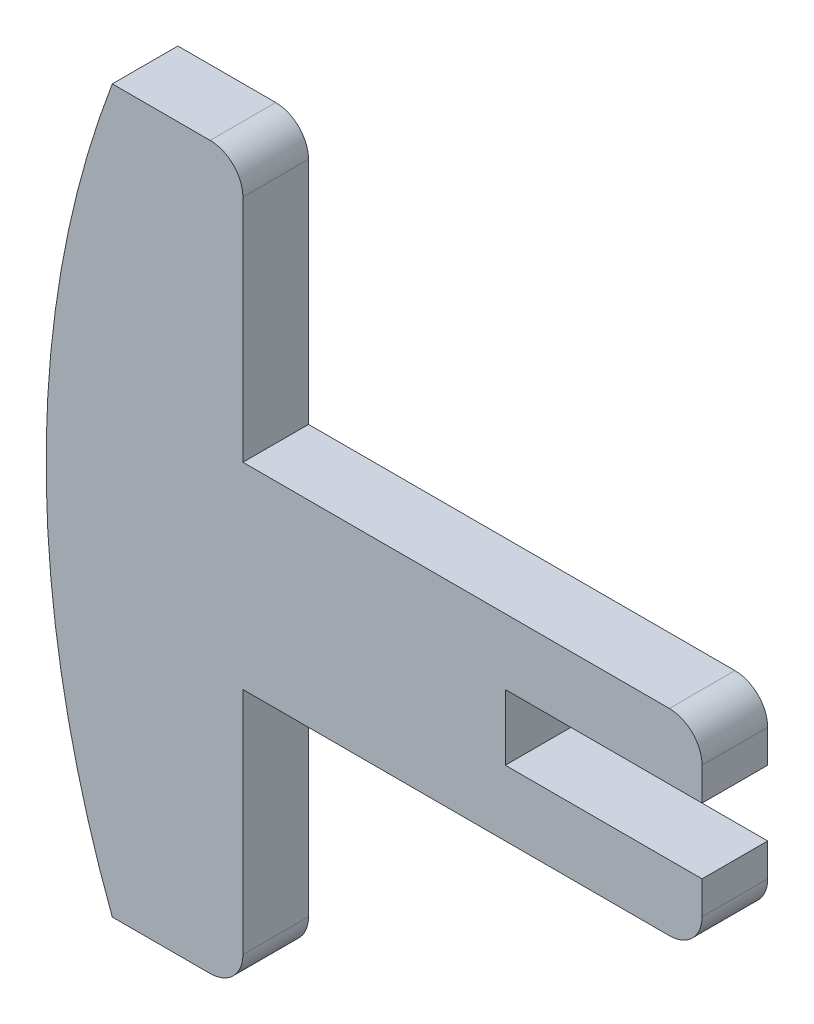
ISO-10303-21;
HEADER;
FILE_DESCRIPTION(('STEP AP214'),'2;1');
FILE_NAME('part.step','',(''),(''),'','','');
FILE_SCHEMA(('AUTOMOTIVE_DESIGN { 1 0 10303 214 1 1 1 1 }'));
ENDSEC;
DATA;
#1=APPLICATION_CONTEXT('core data for automotive mechanical design processes');
#2=APPLICATION_PROTOCOL_DEFINITION('international standard','automotive_design',2000,#1);
#3=PRODUCT_CONTEXT('',#1,'mechanical');
#4=PRODUCT('Part','Part','',(#3));
#5=PRODUCT_RELATED_PRODUCT_CATEGORY('part','',(#4));
#6=PRODUCT_DEFINITION_FORMATION('','',#4);
#7=PRODUCT_DEFINITION_CONTEXT('part definition',#1,'design');
#8=PRODUCT_DEFINITION('design','',#6,#7);
#9=PRODUCT_DEFINITION_SHAPE('','',#8);
#10=(LENGTH_UNIT() NAMED_UNIT(*) SI_UNIT(.MILLI.,.METRE.));
#11=(NAMED_UNIT(*) PLANE_ANGLE_UNIT() SI_UNIT($,.RADIAN.));
#12=(NAMED_UNIT(*) SI_UNIT($,.STERADIAN.) SOLID_ANGLE_UNIT());
#13=UNCERTAINTY_MEASURE_WITH_UNIT(LENGTH_MEASURE(1.E-05),#10,'distance_accuracy_value','');
#14=(GEOMETRIC_REPRESENTATION_CONTEXT(3) GLOBAL_UNCERTAINTY_ASSIGNED_CONTEXT((#13)) GLOBAL_UNIT_ASSIGNED_CONTEXT((#10,
#11,#12)) REPRESENTATION_CONTEXT('',''));
#15=CARTESIAN_POINT('',(0.,0.,0.));
#16=DIRECTION('',(0.,0.,1.));
#17=DIRECTION('',(1.,0.,0.));
#18=AXIS2_PLACEMENT_3D('',#15,#16,#17);
#19=CARTESIAN_POINT('',(-24.9999994718478,9.99999999999999,2.));
#20=DIRECTION('',(-1.,0.,0.));
#21=DIRECTION('',(0.,0.,1.));
#22=AXIS2_PLACEMENT_3D('',#19,#20,#21);
#23=PLANE('',#22);
#24=DIRECTION('',(0.,1.,0.));
#25=VECTOR('',#24,1.);
#26=CARTESIAN_POINT('',(-24.9999994718478,9.99999999999999,0.));
#27=LINE('',#26,#25);
#28=CARTESIAN_POINT('',(-24.9999994718478,2.99999999999999,0.));
#29=VERTEX_POINT('',#28);
#30=CARTESIAN_POINT('',(-24.9999994718478,9.99999999999999,0.));
#31=VERTEX_POINT('',#30);
#32=EDGE_CURVE('E178',#29,#31,#27,.T.);
#33=ORIENTED_EDGE('',*,*,#32,.T.);
#34=DIRECTION('',(0.,0.,-1.));
#35=VECTOR('',#34,1.);
#36=CARTESIAN_POINT('',(-24.9999994718478,9.99999999999999,2.));
#37=LINE('',#36,#35);
#38=CARTESIAN_POINT('',(-24.9999994718478,9.99999999999999,2.));
#39=VERTEX_POINT('',#38);
#40=EDGE_CURVE('E11',#39,#31,#37,.T.);
#41=ORIENTED_EDGE('',*,*,#40,.F.);
#42=DIRECTION('',(0.,1.,0.));
#43=VECTOR('',#42,1.);
#44=CARTESIAN_POINT('',(-24.9999994718478,9.99999999999999,2.));
#45=LINE('',#44,#43);
#46=CARTESIAN_POINT('',(-24.9999994718478,2.99999999999999,2.));
#47=VERTEX_POINT('',#46);
#48=EDGE_CURVE('E208',#47,#39,#45,.T.);
#49=ORIENTED_EDGE('',*,*,#48,.F.);
#50=DIRECTION('',(0.,0.,-1.));
#51=VECTOR('',#50,1.);
#52=CARTESIAN_POINT('',(-24.9999994718478,2.99999999999999,2.));
#53=LINE('',#52,#51);
#54=EDGE_CURVE('E174',#47,#29,#53,.T.);
#55=ORIENTED_EDGE('',*,*,#54,.T.);
#56=EDGE_LOOP('',(#33,#41,#49,#55));
#57=FACE_BOUND('',#56,.T.);
#58=ADVANCED_FACE('F34',(#57),#23,.F.);
#59=CARTESIAN_POINT('',(-25.9999994718478,10.,2.));
#60=DIRECTION('',(0.,0.,-1.));
#61=DIRECTION('',(-1.,0.,0.));
#62=AXIS2_PLACEMENT_3D('',#59,#60,#61);
#63=CYLINDRICAL_SURFACE('',#62,1.);
#64=CARTESIAN_POINT('',(-25.9999994718478,10.,0.));
#65=DIRECTION('',(0.,0.,1.));
#66=DIRECTION('',(1.,0.,0.));
#67=AXIS2_PLACEMENT_3D('',#64,#65,#66);
#68=CIRCLE('',#67,1.);
#69=CARTESIAN_POINT('',(-25.9999994718478,11.,0.));
#70=VERTEX_POINT('',#69);
#71=EDGE_CURVE('E181',#31,#70,#68,.T.);
#72=ORIENTED_EDGE('',*,*,#71,.T.);
#73=DIRECTION('',(0.,0.,-1.));
#74=VECTOR('',#73,1.);
#75=CARTESIAN_POINT('',(-25.9999994718478,11.,2.));
#76=LINE('',#75,#74);
#77=CARTESIAN_POINT('',(-25.9999994718478,11.,2.));
#78=VERTEX_POINT('',#77);
#79=EDGE_CURVE('E42',#78,#70,#76,.T.);
#80=ORIENTED_EDGE('',*,*,#79,.F.);
#81=CARTESIAN_POINT('',(-25.9999994718478,10.,2.));
#82=DIRECTION('',(0.,0.,1.));
#83=DIRECTION('',(1.,0.,0.));
#84=AXIS2_PLACEMENT_3D('',#81,#82,#83);
#85=CIRCLE('',#84,1.);
#86=EDGE_CURVE('E117',#39,#78,#85,.T.);
#87=ORIENTED_EDGE('',*,*,#86,.F.);
#88=ORIENTED_EDGE('',*,*,#40,.T.);
#89=EDGE_LOOP('',(#72,#80,#87,#88));
#90=FACE_BOUND('',#89,.T.);
#91=ADVANCED_FACE('F306',(#90),#63,.T.);
#92=CARTESIAN_POINT('',(-28.9827534923789,11.,2.));
#93=DIRECTION('',(0.,-1.,0.));
#94=DIRECTION('',(0.,0.,-1.));
#95=AXIS2_PLACEMENT_3D('',#92,#93,#94);
#96=PLANE('',#95);
#97=DIRECTION('',(-1.,0.,0.));
#98=VECTOR('',#97,1.);
#99=CARTESIAN_POINT('',(-28.9827534923789,11.,0.));
#100=LINE('',#99,#98);
#101=CARTESIAN_POINT('',(-28.9827534923789,11.,0.));
#102=VERTEX_POINT('',#101);
#103=EDGE_CURVE('E183',#70,#102,#100,.T.);
#104=ORIENTED_EDGE('',*,*,#103,.T.);
#105=DIRECTION('',(0.,0.,-1.));
#106=VECTOR('',#105,1.);
#107=CARTESIAN_POINT('',(-28.9827534923789,11.,2.));
#108=LINE('',#107,#106);
#109=CARTESIAN_POINT('',(-28.9827534923789,11.,2.));
#110=VERTEX_POINT('',#109);
#111=EDGE_CURVE('E239',#110,#102,#108,.T.);
#112=ORIENTED_EDGE('',*,*,#111,.F.);
#113=DIRECTION('',(-1.,0.,0.));
#114=VECTOR('',#113,1.);
#115=CARTESIAN_POINT('',(-28.9827534923789,11.,2.));
#116=LINE('',#115,#114);
#117=EDGE_CURVE('E247',#78,#110,#116,.T.);
#118=ORIENTED_EDGE('',*,*,#117,.F.);
#119=ORIENTED_EDGE('',*,*,#79,.T.);
#120=EDGE_LOOP('',(#104,#112,#118,#119));
#121=FACE_BOUND('',#120,.T.);
#122=ADVANCED_FACE('F245',(#121),#96,.F.);
#123=CARTESIAN_POINT('',(0.,0.,2.));
#124=DIRECTION('',(0.,0.,-1.));
#125=DIRECTION('',(-1.,0.,0.));
#126=AXIS2_PLACEMENT_3D('',#123,#124,#125);
#127=CYLINDRICAL_SURFACE('',#126,31.);
#128=CARTESIAN_POINT('',(0.,0.,0.));
#129=DIRECTION('',(0.,0.,1.));
#130=DIRECTION('',(1.,0.,0.));
#131=AXIS2_PLACEMENT_3D('',#128,#129,#130);
#132=CIRCLE('',#131,31.);
#133=CARTESIAN_POINT('',(-28.9827534923789,-11.,0.));
#134=VERTEX_POINT('',#133);
#135=EDGE_CURVE('E185',#102,#134,#132,.T.);
#136=ORIENTED_EDGE('',*,*,#135,.T.);
#137=DIRECTION('',(0.,0.,-1.));
#138=VECTOR('',#137,1.);
#139=CARTESIAN_POINT('',(-28.9827534923789,-11.,2.));
#140=LINE('',#139,#138);
#141=CARTESIAN_POINT('',(-28.9827534923789,-11.,2.));
#142=VERTEX_POINT('',#141);
#143=EDGE_CURVE('E236',#142,#134,#140,.T.);
#144=ORIENTED_EDGE('',*,*,#143,.F.);
#145=CARTESIAN_POINT('',(0.,0.,2.));
#146=DIRECTION('',(0.,0.,1.));
#147=DIRECTION('',(1.,0.,0.));
#148=AXIS2_PLACEMENT_3D('',#145,#146,#147);
#149=CIRCLE('',#148,31.);
#150=EDGE_CURVE('E265',#110,#142,#149,.T.);
#151=ORIENTED_EDGE('',*,*,#150,.F.);
#152=ORIENTED_EDGE('',*,*,#111,.T.);
#153=EDGE_LOOP('',(#136,#144,#151,#152));
#154=FACE_BOUND('',#153,.T.);
#155=ADVANCED_FACE('F256',(#154),#127,.T.);
#156=CARTESIAN_POINT('',(-28.9827534923789,-11.,2.));
#157=DIRECTION('',(0.,1.,0.));
#158=DIRECTION('',(-1.,0.,0.));
#159=AXIS2_PLACEMENT_3D('',#156,#157,#158);
#160=PLANE('',#159);
#161=DIRECTION('',(1.,0.,0.));
#162=VECTOR('',#161,1.);
#163=CARTESIAN_POINT('',(-28.9827534923789,-11.,0.));
#164=LINE('',#163,#162);
#165=CARTESIAN_POINT('',(-25.9999994718478,-11.,0.));
#166=VERTEX_POINT('',#165);
#167=EDGE_CURVE('E187',#134,#166,#164,.T.);
#168=ORIENTED_EDGE('',*,*,#167,.T.);
#169=DIRECTION('',(0.,0.,-1.));
#170=VECTOR('',#169,1.);
#171=CARTESIAN_POINT('',(-25.9999994718478,-11.,2.));
#172=LINE('',#171,#170);
#173=CARTESIAN_POINT('',(-25.9999994718478,-11.,2.));
#174=VERTEX_POINT('',#173);
#175=EDGE_CURVE('E233',#174,#166,#172,.T.);
#176=ORIENTED_EDGE('',*,*,#175,.F.);
#177=DIRECTION('',(1.,0.,0.));
#178=VECTOR('',#177,1.);
#179=CARTESIAN_POINT('',(-28.9827534923789,-11.,2.));
#180=LINE('',#179,#178);
#181=EDGE_CURVE('E262',#142,#174,#180,.T.);
#182=ORIENTED_EDGE('',*,*,#181,.F.);
#183=ORIENTED_EDGE('',*,*,#143,.T.);
#184=EDGE_LOOP('',(#168,#176,#182,#183));
#185=FACE_BOUND('',#184,.T.);
#186=ADVANCED_FACE('F260',(#185),#160,.F.);
#187=CARTESIAN_POINT('',(-25.9999994718478,-9.99999999999999,2.));
#188=DIRECTION('',(0.,0.,-1.));
#189=DIRECTION('',(-1.,0.,0.));
#190=AXIS2_PLACEMENT_3D('',#187,#188,#189);
#191=CYLINDRICAL_SURFACE('',#190,1.);
#192=CARTESIAN_POINT('',(-25.9999994718478,-9.99999999999999,0.));
#193=DIRECTION('',(0.,0.,1.));
#194=DIRECTION('',(-1.,0.,0.));
#195=AXIS2_PLACEMENT_3D('',#192,#193,#194);
#196=CIRCLE('',#195,1.);
#197=CARTESIAN_POINT('',(-24.9999994718478,-9.99999999999998,0.));
#198=VERTEX_POINT('',#197);
#199=EDGE_CURVE('E189',#166,#198,#196,.T.);
#200=ORIENTED_EDGE('',*,*,#199,.T.);
#201=DIRECTION('',(0.,0.,-1.));
#202=VECTOR('',#201,1.);
#203=CARTESIAN_POINT('',(-24.9999994718478,-9.99999999999998,2.));
#204=LINE('',#203,#202);
#205=CARTESIAN_POINT('',(-24.9999994718478,-9.99999999999998,2.));
#206=VERTEX_POINT('',#205);
#207=EDGE_CURVE('E230',#206,#198,#204,.T.);
#208=ORIENTED_EDGE('',*,*,#207,.F.);
#209=CARTESIAN_POINT('',(-25.9999994718478,-9.99999999999999,2.));
#210=DIRECTION('',(0.,0.,1.));
#211=DIRECTION('',(-1.,0.,0.));
#212=AXIS2_PLACEMENT_3D('',#209,#210,#211);
#213=CIRCLE('',#212,1.);
#214=EDGE_CURVE('E264',#174,#206,#213,.T.);
#215=ORIENTED_EDGE('',*,*,#214,.F.);
#216=ORIENTED_EDGE('',*,*,#175,.T.);
#217=EDGE_LOOP('',(#200,#208,#215,#216));
#218=FACE_BOUND('',#217,.T.);
#219=ADVANCED_FACE('F319',(#218),#191,.T.);
#220=CARTESIAN_POINT('',(-24.9999994718478,-2.99999999999999,2.));
#221=DIRECTION('',(-1.,0.,0.));
#222=DIRECTION('',(0.,-1.,0.));
#223=AXIS2_PLACEMENT_3D('',#220,#221,#222);
#224=PLANE('',#223);
#225=DIRECTION('',(0.,1.,0.));
#226=VECTOR('',#225,1.);
#227=CARTESIAN_POINT('',(-24.9999994718478,-2.99999999999999,0.));
#228=LINE('',#227,#226);
#229=CARTESIAN_POINT('',(-24.9999994718478,-2.99999999999999,0.));
#230=VERTEX_POINT('',#229);
#231=EDGE_CURVE('E191',#198,#230,#228,.T.);
#232=ORIENTED_EDGE('',*,*,#231,.T.);
#233=DIRECTION('',(0.,0.,-1.));
#234=VECTOR('',#233,1.);
#235=CARTESIAN_POINT('',(-24.9999994718478,-2.99999999999999,2.));
#236=LINE('',#235,#234);
#237=CARTESIAN_POINT('',(-24.9999994718478,-2.99999999999999,2.));
#238=VERTEX_POINT('',#237);
#239=EDGE_CURVE('E227',#238,#230,#236,.T.);
#240=ORIENTED_EDGE('',*,*,#239,.F.);
#241=DIRECTION('',(0.,1.,0.));
#242=VECTOR('',#241,1.);
#243=CARTESIAN_POINT('',(-24.9999994718478,-2.99999999999999,2.));
#244=LINE('',#243,#242);
#245=EDGE_CURVE('E267',#206,#238,#244,.T.);
#246=ORIENTED_EDGE('',*,*,#245,.F.);
#247=ORIENTED_EDGE('',*,*,#207,.T.);
#248=EDGE_LOOP('',(#232,#240,#246,#247));
#249=FACE_BOUND('',#248,.T.);
#250=ADVANCED_FACE('F322',(#249),#224,.F.);
#251=CARTESIAN_POINT('',(-24.9999994718478,-2.99999999999999,2.));
#252=DIRECTION('',(0.,1.,0.));
#253=DIRECTION('',(-1.,0.,0.));
#254=AXIS2_PLACEMENT_3D('',#251,#252,#253);
#255=PLANE('',#254);
#256=DIRECTION('',(1.,0.,0.));
#257=VECTOR('',#256,1.);
#258=CARTESIAN_POINT('',(-24.9999994718478,-2.99999999999999,0.));
#259=LINE('',#258,#257);
#260=CARTESIAN_POINT('',(-12.,-2.99999999999999,0.));
#261=VERTEX_POINT('',#260);
#262=EDGE_CURVE('E193',#230,#261,#259,.T.);
#263=ORIENTED_EDGE('',*,*,#262,.T.);
#264=DIRECTION('',(0.,0.,-1.));
#265=VECTOR('',#264,1.);
#266=CARTESIAN_POINT('',(-12.,-2.99999999999999,2.));
#267=LINE('',#266,#265);
#268=CARTESIAN_POINT('',(-12.,-2.99999999999999,2.));
#269=VERTEX_POINT('',#268);
#270=EDGE_CURVE('E224',#269,#261,#267,.T.);
#271=ORIENTED_EDGE('',*,*,#270,.F.);
#272=DIRECTION('',(1.,0.,0.));
#273=VECTOR('',#272,1.);
#274=CARTESIAN_POINT('',(-24.9999994718478,-2.99999999999999,2.));
#275=LINE('',#274,#273);
#276=EDGE_CURVE('E273',#238,#269,#275,.T.);
#277=ORIENTED_EDGE('',*,*,#276,.F.);
#278=ORIENTED_EDGE('',*,*,#239,.T.);
#279=EDGE_LOOP('',(#263,#271,#277,#278));
#280=FACE_BOUND('',#279,.T.);
#281=ADVANCED_FACE('F326',(#280),#255,.F.);
#282=CARTESIAN_POINT('',(-12.,-1.99999999999999,2.));
#283=DIRECTION('',(0.,0.,-1.));
#284=DIRECTION('',(-1.,0.,0.));
#285=AXIS2_PLACEMENT_3D('',#282,#283,#284);
#286=CYLINDRICAL_SURFACE('',#285,1.);
#287=CARTESIAN_POINT('',(-12.,-1.99999999999999,0.));
#288=DIRECTION('',(0.,0.,1.));
#289=DIRECTION('',(-1.,0.,0.));
#290=AXIS2_PLACEMENT_3D('',#287,#288,#289);
#291=CIRCLE('',#290,1.);
#292=CARTESIAN_POINT('',(-11.,-1.99999999999998,0.));
#293=VERTEX_POINT('',#292);
#294=EDGE_CURVE('E195',#261,#293,#291,.T.);
#295=ORIENTED_EDGE('',*,*,#294,.T.);
#296=DIRECTION('',(0.,0.,-1.));
#297=VECTOR('',#296,1.);
#298=CARTESIAN_POINT('',(-11.,-1.99999999999998,2.));
#299=LINE('',#298,#297);
#300=CARTESIAN_POINT('',(-11.,-1.99999999999998,2.));
#301=VERTEX_POINT('',#300);
#302=EDGE_CURVE('E221',#301,#293,#299,.T.);
#303=ORIENTED_EDGE('',*,*,#302,.F.);
#304=CARTESIAN_POINT('',(-12.,-1.99999999999999,2.));
#305=DIRECTION('',(0.,0.,1.));
#306=DIRECTION('',(-1.,0.,0.));
#307=AXIS2_PLACEMENT_3D('',#304,#305,#306);
#308=CIRCLE('',#307,1.);
#309=EDGE_CURVE('E275',#269,#301,#308,.T.);
#310=ORIENTED_EDGE('',*,*,#309,.F.);
#311=ORIENTED_EDGE('',*,*,#270,.T.);
#312=EDGE_LOOP('',(#295,#303,#310,#311));
#313=FACE_BOUND('',#312,.T.);
#314=ADVANCED_FACE('F330',(#313),#286,.T.);
#315=CARTESIAN_POINT('',(-11.,-1.,2.));
#316=DIRECTION('',(-1.,0.,0.));
#317=DIRECTION('',(0.,0.,1.));
#318=AXIS2_PLACEMENT_3D('',#315,#316,#317);
#319=PLANE('',#318);
#320=DIRECTION('',(0.,1.,0.));
#321=VECTOR('',#320,1.);
#322=CARTESIAN_POINT('',(-11.,-1.,0.));
#323=LINE('',#322,#321);
#324=CARTESIAN_POINT('',(-11.,-1.,0.));
#325=VERTEX_POINT('',#324);
#326=EDGE_CURVE('E197',#293,#325,#323,.T.);
#327=ORIENTED_EDGE('',*,*,#326,.T.);
#328=DIRECTION('',(0.,0.,-1.));
#329=VECTOR('',#328,1.);
#330=CARTESIAN_POINT('',(-11.,-1.,2.));
#331=LINE('',#330,#329);
#332=CARTESIAN_POINT('',(-11.,-1.,2.));
#333=VERTEX_POINT('',#332);
#334=EDGE_CURVE('E218',#333,#325,#331,.T.);
#335=ORIENTED_EDGE('',*,*,#334,.F.);
#336=DIRECTION('',(0.,1.,0.));
#337=VECTOR('',#336,1.);
#338=CARTESIAN_POINT('',(-11.,-1.,2.));
#339=LINE('',#338,#337);
#340=EDGE_CURVE('E277',#301,#333,#339,.T.);
#341=ORIENTED_EDGE('',*,*,#340,.F.);
#342=ORIENTED_EDGE('',*,*,#302,.T.);
#343=EDGE_LOOP('',(#327,#335,#341,#342));
#344=FACE_BOUND('',#343,.T.);
#345=ADVANCED_FACE('F334',(#344),#319,.F.);
#346=CARTESIAN_POINT('',(-17.,-1.,2.));
#347=DIRECTION('',(0.,-1.,0.));
#348=DIRECTION('',(0.,0.,-1.));
#349=AXIS2_PLACEMENT_3D('',#346,#347,#348);
#350=PLANE('',#349);
#351=DIRECTION('',(-1.,0.,0.));
#352=VECTOR('',#351,1.);
#353=CARTESIAN_POINT('',(-17.,-1.,0.));
#354=LINE('',#353,#352);
#355=CARTESIAN_POINT('',(-17.,-1.,0.));
#356=VERTEX_POINT('',#355);
#357=EDGE_CURVE('E199',#325,#356,#354,.T.);
#358=ORIENTED_EDGE('',*,*,#357,.T.);
#359=DIRECTION('',(0.,0.,-1.));
#360=VECTOR('',#359,1.);
#361=CARTESIAN_POINT('',(-17.,-1.,2.));
#362=LINE('',#361,#360);
#363=CARTESIAN_POINT('',(-17.,-1.,2.));
#364=VERTEX_POINT('',#363);
#365=EDGE_CURVE('E215',#364,#356,#362,.T.);
#366=ORIENTED_EDGE('',*,*,#365,.F.);
#367=DIRECTION('',(-1.,0.,0.));
#368=VECTOR('',#367,1.);
#369=CARTESIAN_POINT('',(-17.,-1.,2.));
#370=LINE('',#369,#368);
#371=EDGE_CURVE('E279',#333,#364,#370,.T.);
#372=ORIENTED_EDGE('',*,*,#371,.F.);
#373=ORIENTED_EDGE('',*,*,#334,.T.);
#374=EDGE_LOOP('',(#358,#366,#372,#373));
#375=FACE_BOUND('',#374,.T.);
#376=ADVANCED_FACE('F338',(#375),#350,.F.);
#377=CARTESIAN_POINT('',(-17.,1.,2.));
#378=DIRECTION('',(-1.,0.,0.));
#379=DIRECTION('',(0.,0.,1.));
#380=AXIS2_PLACEMENT_3D('',#377,#378,#379);
#381=PLANE('',#380);
#382=DIRECTION('',(0.,1.,0.));
#383=VECTOR('',#382,1.);
#384=CARTESIAN_POINT('',(-17.,1.,0.));
#385=LINE('',#384,#383);
#386=CARTESIAN_POINT('',(-17.,1.,0.));
#387=VERTEX_POINT('',#386);
#388=EDGE_CURVE('E201',#356,#387,#385,.T.);
#389=ORIENTED_EDGE('',*,*,#388,.T.);
#390=DIRECTION('',(0.,0.,-1.));
#391=VECTOR('',#390,1.);
#392=CARTESIAN_POINT('',(-17.,1.,2.));
#393=LINE('',#392,#391);
#394=CARTESIAN_POINT('',(-17.,1.,2.));
#395=VERTEX_POINT('',#394);
#396=EDGE_CURVE('E212',#395,#387,#393,.T.);
#397=ORIENTED_EDGE('',*,*,#396,.F.);
#398=DIRECTION('',(0.,1.,0.));
#399=VECTOR('',#398,1.);
#400=CARTESIAN_POINT('',(-17.,1.,2.));
#401=LINE('',#400,#399);
#402=EDGE_CURVE('E281',#364,#395,#401,.T.);
#403=ORIENTED_EDGE('',*,*,#402,.F.);
#404=ORIENTED_EDGE('',*,*,#365,.T.);
#405=EDGE_LOOP('',(#389,#397,#403,#404));
#406=FACE_BOUND('',#405,.T.);
#407=ADVANCED_FACE('F287',(#406),#381,.F.);
#408=CARTESIAN_POINT('',(-17.,1.,2.));
#409=DIRECTION('',(0.,1.,0.));
#410=DIRECTION('',(0.,0.,1.));
#411=AXIS2_PLACEMENT_3D('',#408,#409,#410);
#412=PLANE('',#411);
#413=DIRECTION('',(1.,0.,0.));
#414=VECTOR('',#413,1.);
#415=CARTESIAN_POINT('',(-17.,1.,0.));
#416=LINE('',#415,#414);
#417=CARTESIAN_POINT('',(-11.,1.,0.));
#418=VERTEX_POINT('',#417);
#419=EDGE_CURVE('E203',#387,#418,#416,.T.);
#420=ORIENTED_EDGE('',*,*,#419,.T.);
#421=DIRECTION('',(0.,0.,-1.));
#422=VECTOR('',#421,1.);
#423=CARTESIAN_POINT('',(-11.,1.,2.));
#424=LINE('',#423,#422);
#425=CARTESIAN_POINT('',(-11.,1.,2.));
#426=VERTEX_POINT('',#425);
#427=EDGE_CURVE('E169',#426,#418,#424,.T.);
#428=ORIENTED_EDGE('',*,*,#427,.F.);
#429=DIRECTION('',(1.,0.,0.));
#430=VECTOR('',#429,1.);
#431=CARTESIAN_POINT('',(-17.,1.,2.));
#432=LINE('',#431,#430);
#433=EDGE_CURVE('E160',#395,#426,#432,.T.);
#434=ORIENTED_EDGE('',*,*,#433,.F.);
#435=ORIENTED_EDGE('',*,*,#396,.T.);
#436=EDGE_LOOP('',(#420,#428,#434,#435));
#437=FACE_BOUND('',#436,.T.);
#438=ADVANCED_FACE('F291',(#437),#412,.F.);
#439=CARTESIAN_POINT('',(-11.,1.,2.));
#440=DIRECTION('',(-1.,0.,0.));
#441=DIRECTION('',(0.,0.,1.));
#442=AXIS2_PLACEMENT_3D('',#439,#440,#441);
#443=PLANE('',#442);
#444=DIRECTION('',(0.,1.,0.));
#445=VECTOR('',#444,1.);
#446=CARTESIAN_POINT('',(-11.,1.,0.));
#447=LINE('',#446,#445);
#448=CARTESIAN_POINT('',(-11.,1.99999999999999,0.));
#449=VERTEX_POINT('',#448);
#450=EDGE_CURVE('E168',#418,#449,#447,.T.);
#451=ORIENTED_EDGE('',*,*,#450,.T.);
#452=DIRECTION('',(0.,0.,-1.));
#453=VECTOR('',#452,1.);
#454=CARTESIAN_POINT('',(-11.,1.99999999999999,2.));
#455=LINE('',#454,#453);
#456=CARTESIAN_POINT('',(-11.,1.99999999999999,2.));
#457=VERTEX_POINT('',#456);
#458=EDGE_CURVE('E165',#457,#449,#455,.T.);
#459=ORIENTED_EDGE('',*,*,#458,.F.);
#460=DIRECTION('',(0.,1.,0.));
#461=VECTOR('',#460,1.);
#462=CARTESIAN_POINT('',(-11.,1.,2.));
#463=LINE('',#462,#461);
#464=EDGE_CURVE('E154',#426,#457,#463,.T.);
#465=ORIENTED_EDGE('',*,*,#464,.F.);
#466=ORIENTED_EDGE('',*,*,#427,.T.);
#467=EDGE_LOOP('',(#451,#459,#465,#466));
#468=FACE_BOUND('',#467,.T.);
#469=ADVANCED_FACE('F166',(#468),#443,.F.);
#470=CARTESIAN_POINT('',(-12.,1.99999999999999,2.));
#471=DIRECTION('',(0.,0.,-1.));
#472=DIRECTION('',(-1.,0.,0.));
#473=AXIS2_PLACEMENT_3D('',#470,#471,#472);
#474=CYLINDRICAL_SURFACE('',#473,0.999999999999999);
#475=CARTESIAN_POINT('',(-12.,1.99999999999999,0.));
#476=DIRECTION('',(0.,0.,1.));
#477=DIRECTION('',(1.,0.,0.));
#478=AXIS2_PLACEMENT_3D('',#475,#476,#477);
#479=CIRCLE('',#478,0.999999999999999);
#480=CARTESIAN_POINT('',(-12.,2.99999999999999,0.));
#481=VERTEX_POINT('',#480);
#482=EDGE_CURVE('E103',#449,#481,#479,.T.);
#483=ORIENTED_EDGE('',*,*,#482,.T.);
#484=DIRECTION('',(0.,0.,-1.));
#485=VECTOR('',#484,1.);
#486=CARTESIAN_POINT('',(-12.,2.99999999999999,2.));
#487=LINE('',#486,#485);
#488=CARTESIAN_POINT('',(-12.,2.99999999999999,2.));
#489=VERTEX_POINT('',#488);
#490=EDGE_CURVE('E170',#489,#481,#487,.T.);
#491=ORIENTED_EDGE('',*,*,#490,.F.);
#492=CARTESIAN_POINT('',(-12.,1.99999999999999,2.));
#493=DIRECTION('',(0.,0.,1.));
#494=DIRECTION('',(1.,0.,0.));
#495=AXIS2_PLACEMENT_3D('',#492,#493,#494);
#496=CIRCLE('',#495,0.999999999999999);
#497=EDGE_CURVE('E158',#457,#489,#496,.T.);
#498=ORIENTED_EDGE('',*,*,#497,.F.);
#499=ORIENTED_EDGE('',*,*,#458,.T.);
#500=EDGE_LOOP('',(#483,#491,#498,#499));
#501=FACE_BOUND('',#500,.T.);
#502=ADVANCED_FACE('F172',(#501),#474,.T.);
#503=CARTESIAN_POINT('',(-24.9999994718478,2.99999999999999,2.));
#504=DIRECTION('',(0.,-1.,0.));
#505=DIRECTION('',(0.,0.,-1.));
#506=AXIS2_PLACEMENT_3D('',#503,#504,#505);
#507=PLANE('',#506);
#508=DIRECTION('',(-1.,0.,0.));
#509=VECTOR('',#508,1.);
#510=CARTESIAN_POINT('',(-24.9999994718478,2.99999999999999,0.));
#511=LINE('',#510,#509);
#512=EDGE_CURVE('E109',#481,#29,#511,.T.);
#513=ORIENTED_EDGE('',*,*,#512,.T.);
#514=ORIENTED_EDGE('',*,*,#54,.F.);
#515=DIRECTION('',(-1.,0.,0.));
#516=VECTOR('',#515,1.);
#517=CARTESIAN_POINT('',(-24.9999994718478,2.99999999999999,2.));
#518=LINE('',#517,#516);
#519=EDGE_CURVE('E50',#489,#47,#518,.T.);
#520=ORIENTED_EDGE('',*,*,#519,.F.);
#521=ORIENTED_EDGE('',*,*,#490,.T.);
#522=EDGE_LOOP('',(#513,#514,#520,#521));
#523=FACE_BOUND('',#522,.T.);
#524=ADVANCED_FACE('F295',(#523),#507,.F.);
#525=CARTESIAN_POINT('',(-12.,1.99999999999999,2.));
#526=DIRECTION('',(0.,0.,1.));
#527=DIRECTION('',(1.,0.,0.));
#528=AXIS2_PLACEMENT_3D('',#525,#526,#527);
#529=PLANE('',#528);
#530=ORIENTED_EDGE('',*,*,#48,.T.);
#531=ORIENTED_EDGE('',*,*,#86,.T.);
#532=ORIENTED_EDGE('',*,*,#117,.T.);
#533=ORIENTED_EDGE('',*,*,#150,.T.);
#534=ORIENTED_EDGE('',*,*,#181,.T.);
#535=ORIENTED_EDGE('',*,*,#214,.T.);
#536=ORIENTED_EDGE('',*,*,#245,.T.);
#537=ORIENTED_EDGE('',*,*,#276,.T.);
#538=ORIENTED_EDGE('',*,*,#309,.T.);
#539=ORIENTED_EDGE('',*,*,#340,.T.);
#540=ORIENTED_EDGE('',*,*,#371,.T.);
#541=ORIENTED_EDGE('',*,*,#402,.T.);
#542=ORIENTED_EDGE('',*,*,#433,.T.);
#543=ORIENTED_EDGE('',*,*,#464,.T.);
#544=ORIENTED_EDGE('',*,*,#497,.T.);
#545=ORIENTED_EDGE('',*,*,#519,.T.);
#546=EDGE_LOOP('',(#530,#531,#532,#533,#534,#535,#536,#537,#538,#539,#540,#541,#542,#543,#544,#545));
#547=FACE_BOUND('',#546,.T.);
#548=ADVANCED_FACE('F156',(#547),#529,.T.);
#549=CARTESIAN_POINT('',(-12.,1.99999999999999,0.));
#550=DIRECTION('',(0.,0.,1.));
#551=DIRECTION('',(1.,0.,0.));
#552=AXIS2_PLACEMENT_3D('',#549,#550,#551);
#553=PLANE('',#552);
#554=ORIENTED_EDGE('',*,*,#32,.F.);
#555=ORIENTED_EDGE('',*,*,#512,.F.);
#556=ORIENTED_EDGE('',*,*,#482,.F.);
#557=ORIENTED_EDGE('',*,*,#450,.F.);
#558=ORIENTED_EDGE('',*,*,#419,.F.);
#559=ORIENTED_EDGE('',*,*,#388,.F.);
#560=ORIENTED_EDGE('',*,*,#357,.F.);
#561=ORIENTED_EDGE('',*,*,#326,.F.);
#562=ORIENTED_EDGE('',*,*,#294,.F.);
#563=ORIENTED_EDGE('',*,*,#262,.F.);
#564=ORIENTED_EDGE('',*,*,#231,.F.);
#565=ORIENTED_EDGE('',*,*,#199,.F.);
#566=ORIENTED_EDGE('',*,*,#167,.F.);
#567=ORIENTED_EDGE('',*,*,#135,.F.);
#568=ORIENTED_EDGE('',*,*,#103,.F.);
#569=ORIENTED_EDGE('',*,*,#71,.F.);
#570=EDGE_LOOP('',(#554,#555,#556,#557,#558,#559,#560,#561,#562,#563,#564,#565,#566,#567,#568,#569));
#571=FACE_BOUND('',#570,.T.);
#572=ADVANCED_FACE('F251',(#571),#553,.F.);
#573=CLOSED_SHELL('',(#58,#91,#122,#155,#186,#219,#250,#281,#314,#345,#376,#407,#438,#469,#502,
#524,#548,#572));
#574=MANIFOLD_SOLID_BREP('B2',#573);
#575=ADVANCED_BREP_SHAPE_REPRESENTATION('',(#18,#574),#14);
#576=SHAPE_DEFINITION_REPRESENTATION(#9,#575);
ENDSEC;
END-ISO-10303-21;
